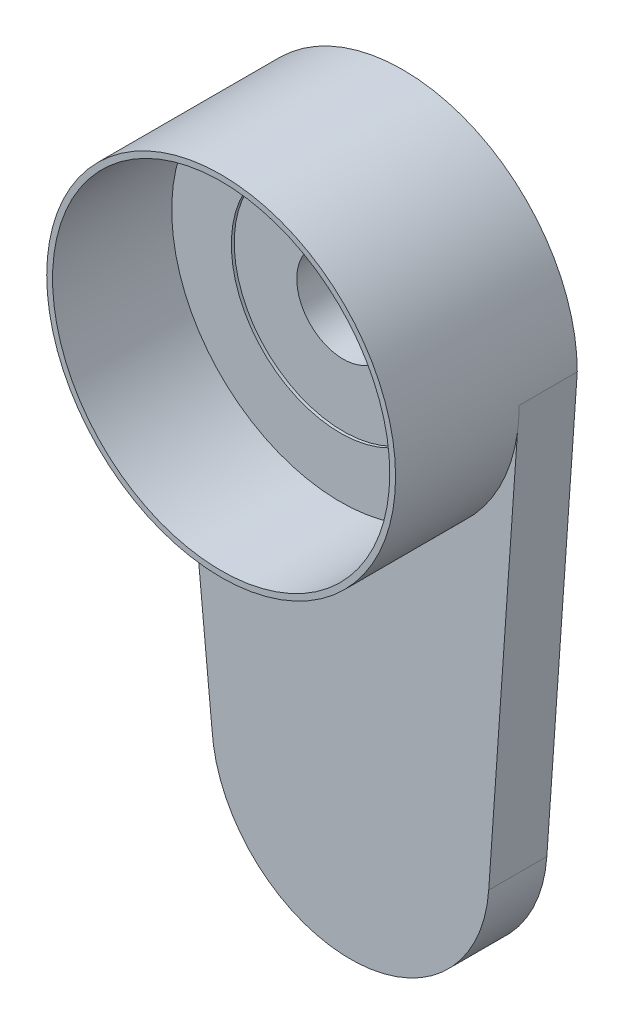
ISO-10303-21;
HEADER;
FILE_DESCRIPTION(('STEP AP214'),'2;1');
FILE_NAME('part.step','',(''),(''),'','','');
FILE_SCHEMA(('AUTOMOTIVE_DESIGN { 1 0 10303 214 1 1 1 1 }'));
ENDSEC;
DATA;
#1=APPLICATION_CONTEXT('core data for automotive mechanical design processes');
#2=APPLICATION_PROTOCOL_DEFINITION('international standard','automotive_design',2000,#1);
#3=PRODUCT_CONTEXT('',#1,'mechanical');
#4=PRODUCT('Part','Part','',(#3));
#5=PRODUCT_RELATED_PRODUCT_CATEGORY('part','',(#4));
#6=PRODUCT_DEFINITION_FORMATION('','',#4);
#7=PRODUCT_DEFINITION_CONTEXT('part definition',#1,'design');
#8=PRODUCT_DEFINITION('design','',#6,#7);
#9=PRODUCT_DEFINITION_SHAPE('','',#8);
#10=(LENGTH_UNIT() NAMED_UNIT(*) SI_UNIT(.MILLI.,.METRE.));
#11=(NAMED_UNIT(*) PLANE_ANGLE_UNIT() SI_UNIT($,.RADIAN.));
#12=(NAMED_UNIT(*) SI_UNIT($,.STERADIAN.) SOLID_ANGLE_UNIT());
#13=UNCERTAINTY_MEASURE_WITH_UNIT(LENGTH_MEASURE(1.E-05),#10,'distance_accuracy_value','');
#14=(GEOMETRIC_REPRESENTATION_CONTEXT(3) GLOBAL_UNCERTAINTY_ASSIGNED_CONTEXT((#13)) GLOBAL_UNIT_ASSIGNED_CONTEXT((#10,
#11,#12)) REPRESENTATION_CONTEXT('',''));
#15=CARTESIAN_POINT('',(0.,0.,0.));
#16=DIRECTION('',(0.,0.,1.));
#17=DIRECTION('',(1.,0.,0.));
#18=AXIS2_PLACEMENT_3D('',#15,#16,#17);
#19=CARTESIAN_POINT('',(0.,0.,0.));
#20=DIRECTION('',(0.,0.,1.));
#21=DIRECTION('',(1.,0.,0.));
#22=AXIS2_PLACEMENT_3D('',#19,#20,#21);
#23=PLANE('',#22);
#24=DIRECTION('',(-0.0697887398607694,-0.997561793468778,0.));
#25=VECTOR('',#24,1.);
#26=CARTESIAN_POINT('',(119.415543814638,-8.35422965993222,0.));
#27=LINE('',#26,#25);
#28=CARTESIAN_POINT('',(120.,0.,0.));
#29=VERTEX_POINT('',#28);
#30=CARTESIAN_POINT('',(118.831087629275,-16.7084593198645,0.));
#31=VERTEX_POINT('',#30);
#32=EDGE_CURVE('E106',#29,#31,#27,.T.);
#33=ORIENTED_EDGE('',*,*,#32,.F.);
#34=CARTESIAN_POINT('',(0.,0.,0.));
#35=DIRECTION('',(0.,0.,1.));
#36=DIRECTION('',(1.,0.,0.));
#37=AXIS2_PLACEMENT_3D('',#34,#35,#36);
#38=CIRCLE('',#37,120.);
#39=EDGE_CURVE('E133',#31,#29,#38,.T.);
#40=ORIENTED_EDGE('',*,*,#39,.F.);
#41=EDGE_LOOP('',(#33,#40));
#42=FACE_BOUND('',#41,.T.);
#43=ADVANCED_FACE('F34',(#42),#23,.F.);
#44=CARTESIAN_POINT('',(0.,0.,85.));
#45=DIRECTION('',(0.,0.,-1.));
#46=DIRECTION('',(-1.,0.,0.));
#47=AXIS2_PLACEMENT_3D('',#44,#45,#46);
#48=CYLINDRICAL_SURFACE('',#47,120.);
#49=CARTESIAN_POINT('',(0.,0.,85.));
#50=DIRECTION('',(0.,0.,1.));
#51=DIRECTION('',(1.,0.,0.));
#52=AXIS2_PLACEMENT_3D('',#49,#50,#51);
#53=CIRCLE('',#52,120.);
#54=CARTESIAN_POINT('',(120.,0.,85.));
#55=VERTEX_POINT('',#54);
#56=EDGE_CURVE('E11',#55,#55,#53,.T.);
#57=ORIENTED_EDGE('',*,*,#56,.F.);
#58=EDGE_LOOP('',(#57));
#59=FACE_BOUND('',#58,.T.);
#60=ORIENTED_EDGE('',*,*,#39,.T.);
#61=DIRECTION('',(0.,0.,1.));
#62=VECTOR('',#61,1.);
#63=CARTESIAN_POINT('',(120.,0.,-40.));
#64=LINE('',#63,#62);
#65=CARTESIAN_POINT('',(120.,0.,-40.));
#66=VERTEX_POINT('',#65);
#67=EDGE_CURVE('E88',#66,#29,#64,.T.);
#68=ORIENTED_EDGE('',*,*,#67,.F.);
#69=CARTESIAN_POINT('',(0.,0.,-40.));
#70=DIRECTION('',(0.,0.,-1.));
#71=DIRECTION('',(-1.,0.,0.));
#72=AXIS2_PLACEMENT_3D('',#69,#70,#71);
#73=CIRCLE('',#72,120.);
#74=CARTESIAN_POINT('',(-120.,1.07552855510562E-13,-40.));
#75=VERTEX_POINT('',#74);
#76=EDGE_CURVE('E91',#75,#66,#73,.T.);
#77=ORIENTED_EDGE('',*,*,#76,.F.);
#78=DIRECTION('',(0.,0.,1.));
#79=VECTOR('',#78,1.);
#80=CARTESIAN_POINT('',(-120.,1.07552855510562E-13,-40.));
#81=LINE('',#80,#79);
#82=CARTESIAN_POINT('',(-120.,1.07552855510562E-13,0.));
#83=VERTEX_POINT('',#82);
#84=EDGE_CURVE('E79',#75,#83,#81,.T.);
#85=ORIENTED_EDGE('',*,*,#84,.T.);
#86=CARTESIAN_POINT('',(-117.805011812381,-22.8468639398211,0.));
#87=VERTEX_POINT('',#86);
#88=EDGE_CURVE('E43',#83,#87,#38,.T.);
#89=ORIENTED_EDGE('',*,*,#88,.T.);
#90=EDGE_CURVE('E136',#87,#31,#38,.T.);
#91=ORIENTED_EDGE('',*,*,#90,.T.);
#92=EDGE_LOOP('',(#60,#68,#77,#85,#89,#91));
#93=FACE_BOUND('',#92,.T.);
#94=ADVANCED_FACE('F36',(#59,#93),#48,.T.);
#95=CARTESIAN_POINT('',(0.,0.,85.));
#96=DIRECTION('',(0.,0.,1.));
#97=DIRECTION('',(1.,0.,0.));
#98=AXIS2_PLACEMENT_3D('',#95,#96,#97);
#99=PLANE('',#98);
#100=CARTESIAN_POINT('',(0.,0.,85.));
#101=DIRECTION('',(0.,0.,1.));
#102=DIRECTION('',(1.,0.,0.));
#103=AXIS2_PLACEMENT_3D('',#100,#101,#102);
#104=CIRCLE('',#103,116.);
#105=CARTESIAN_POINT('',(116.,0.,85.));
#106=VERTEX_POINT('',#105);
#107=EDGE_CURVE('E134',#106,#106,#104,.T.);
#108=ORIENTED_EDGE('',*,*,#107,.F.);
#109=EDGE_LOOP('',(#108));
#110=FACE_BOUND('',#109,.T.);
#111=ORIENTED_EDGE('',*,*,#56,.T.);
#112=EDGE_LOOP('',(#111));
#113=FACE_BOUND('',#112,.T.);
#114=ADVANCED_FACE('F154',(#110,#113),#99,.T.);
#115=ORIENTED_EDGE('',*,*,#88,.F.);
#116=DIRECTION('',(0.0956335930260791,-0.995416604183857,0.));
#117=VECTOR('',#116,1.);
#118=CARTESIAN_POINT('',(-118.902505906191,-11.4234319699105,0.));
#119=LINE('',#118,#117);
#120=EDGE_CURVE('E50',#83,#87,#119,.T.);
#121=ORIENTED_EDGE('',*,*,#120,.T.);
#122=EDGE_LOOP('',(#115,#121));
#123=FACE_BOUND('',#122,.T.);
#124=ADVANCED_FACE('F150',(#123),#23,.F.);
#125=CARTESIAN_POINT('',(0.,0.,3.));
#126=DIRECTION('',(0.,0.,1.));
#127=DIRECTION('',(1.,0.,0.));
#128=AXIS2_PLACEMENT_3D('',#125,#126,#127);
#129=CYLINDRICAL_SURFACE('',#128,116.);
#130=CARTESIAN_POINT('',(0.,0.,3.));
#131=DIRECTION('',(0.,0.,1.));
#132=DIRECTION('',(1.,0.,0.));
#133=AXIS2_PLACEMENT_3D('',#130,#131,#132);
#134=CIRCLE('',#133,116.);
#135=CARTESIAN_POINT('',(116.,0.,3.));
#136=VERTEX_POINT('',#135);
#137=EDGE_CURVE('E130',#136,#136,#134,.T.);
#138=ORIENTED_EDGE('',*,*,#137,.F.);
#139=EDGE_LOOP('',(#138));
#140=FACE_BOUND('',#139,.T.);
#141=ORIENTED_EDGE('',*,*,#107,.T.);
#142=EDGE_LOOP('',(#141));
#143=FACE_BOUND('',#142,.T.);
#144=ADVANCED_FACE('F158',(#140,#143),#129,.F.);
#145=CARTESIAN_POINT('',(0.,0.,3.));
#146=DIRECTION('',(0.,0.,1.));
#147=DIRECTION('',(1.,0.,0.));
#148=AXIS2_PLACEMENT_3D('',#145,#146,#147);
#149=PLANE('',#148);
#150=CARTESIAN_POINT('',(0.,0.,3.));
#151=DIRECTION('',(0.,0.,1.));
#152=DIRECTION('',(1.,0.,0.));
#153=AXIS2_PLACEMENT_3D('',#150,#151,#152);
#154=CIRCLE('',#153,75.);
#155=CARTESIAN_POINT('',(75.,0.,3.));
#156=VERTEX_POINT('',#155);
#157=EDGE_CURVE('E38',#156,#156,#154,.T.);
#158=ORIENTED_EDGE('',*,*,#157,.F.);
#159=EDGE_LOOP('',(#158));
#160=FACE_BOUND('',#159,.T.);
#161=ORIENTED_EDGE('',*,*,#137,.T.);
#162=EDGE_LOOP('',(#161));
#163=FACE_BOUND('',#162,.T.);
#164=ADVANCED_FACE('F163',(#160,#163),#149,.T.);
#165=CARTESIAN_POINT('',(0.,0.,1.));
#166=DIRECTION('',(0.,0.,1.));
#167=DIRECTION('',(1.,0.,0.));
#168=AXIS2_PLACEMENT_3D('',#165,#166,#167);
#169=CYLINDRICAL_SURFACE('',#168,75.);
#170=ORIENTED_EDGE('',*,*,#157,.T.);
#171=EDGE_LOOP('',(#170));
#172=FACE_BOUND('',#171,.T.);
#173=CARTESIAN_POINT('',(0.,0.,1.));
#174=DIRECTION('',(0.,0.,1.));
#175=DIRECTION('',(1.,0.,0.));
#176=AXIS2_PLACEMENT_3D('',#173,#174,#175);
#177=CIRCLE('',#176,75.);
#178=CARTESIAN_POINT('',(75.,0.,1.));
#179=VERTEX_POINT('',#178);
#180=EDGE_CURVE('E127',#179,#179,#177,.T.);
#181=ORIENTED_EDGE('',*,*,#180,.F.);
#182=EDGE_LOOP('',(#181));
#183=FACE_BOUND('',#182,.T.);
#184=ADVANCED_FACE('F174',(#172,#183),#169,.F.);
#185=CARTESIAN_POINT('',(0.,0.,1.));
#186=DIRECTION('',(0.,0.,1.));
#187=DIRECTION('',(1.,0.,0.));
#188=AXIS2_PLACEMENT_3D('',#185,#186,#187);
#189=PLANE('',#188);
#190=CARTESIAN_POINT('',(0.,0.,1.));
#191=DIRECTION('',(0.,0.,1.));
#192=DIRECTION('',(1.,0.,0.));
#193=AXIS2_PLACEMENT_3D('',#190,#191,#192);
#194=CIRCLE('',#193,32.);
#195=CARTESIAN_POINT('',(32.,0.,1.));
#196=VERTEX_POINT('',#195);
#197=EDGE_CURVE('E87',#196,#196,#194,.T.);
#198=ORIENTED_EDGE('',*,*,#197,.F.);
#199=EDGE_LOOP('',(#198));
#200=FACE_BOUND('',#199,.T.);
#201=ORIENTED_EDGE('',*,*,#180,.T.);
#202=EDGE_LOOP('',(#201));
#203=FACE_BOUND('',#202,.T.);
#204=ADVANCED_FACE('F178',(#200,#203),#189,.T.);
#205=CARTESIAN_POINT('',(0.,0.,-4.));
#206=DIRECTION('',(0.,0.,1.));
#207=DIRECTION('',(1.,0.,0.));
#208=AXIS2_PLACEMENT_3D('',#205,#206,#207);
#209=CYLINDRICAL_SURFACE('',#208,32.);
#210=ORIENTED_EDGE('',*,*,#197,.T.);
#211=EDGE_LOOP('',(#210));
#212=FACE_BOUND('',#211,.T.);
#213=CARTESIAN_POINT('',(0.,0.,-40.));
#214=DIRECTION('',(0.,0.,-1.));
#215=DIRECTION('',(-1.,0.,0.));
#216=AXIS2_PLACEMENT_3D('',#213,#214,#215);
#217=CIRCLE('',#216,32.);
#218=CARTESIAN_POINT('',(-32.,0.,-40.));
#219=VERTEX_POINT('',#218);
#220=EDGE_CURVE('E111',#219,#219,#217,.F.);
#221=ORIENTED_EDGE('',*,*,#220,.F.);
#222=EDGE_LOOP('',(#221));
#223=FACE_BOUND('',#222,.T.);
#224=ADVANCED_FACE('F182',(#212,#223),#209,.F.);
#225=CARTESIAN_POINT('',(-118.902505906191,-11.4234319699105,-40.));
#226=DIRECTION('',(-0.995416604183857,-0.0956335930260791,0.));
#227=DIRECTION('',(0.0956335930260791,-0.995416604183857,0.));
#228=AXIS2_PLACEMENT_3D('',#225,#226,#227);
#229=PLANE('',#228);
#230=ORIENTED_EDGE('',*,*,#120,.F.);
#231=ORIENTED_EDGE('',*,*,#84,.F.);
#232=DIRECTION('',(0.0956335930260791,-0.995416604183857,0.));
#233=VECTOR('',#232,1.);
#234=CARTESIAN_POINT('',(-118.902505906191,-11.4234319699105,-40.));
#235=LINE('',#234,#233);
#236=CARTESIAN_POINT('',(-91.3099220921763,-298.624981255157,-40.));
#237=VERTEX_POINT('',#236);
#238=EDGE_CURVE('E84',#75,#237,#235,.T.);
#239=ORIENTED_EDGE('',*,*,#238,.T.);
#240=DIRECTION('',(0.,0.,1.));
#241=VECTOR('',#240,1.);
#242=CARTESIAN_POINT('',(-91.3099220921763,-298.624981255157,-40.));
#243=LINE('',#242,#241);
#244=CARTESIAN_POINT('',(-91.3099220921763,-298.624981255157,0.));
#245=VERTEX_POINT('',#244);
#246=EDGE_CURVE('E114',#237,#245,#243,.T.);
#247=ORIENTED_EDGE('',*,*,#246,.T.);
#248=EDGE_CURVE('E117',#87,#245,#119,.T.);
#249=ORIENTED_EDGE('',*,*,#248,.F.);
#250=EDGE_LOOP('',(#230,#231,#239,#247,#249));
#251=FACE_BOUND('',#250,.T.);
#252=ADVANCED_FACE('F81',(#251),#229,.T.);
#253=CARTESIAN_POINT('',(119.415543814638,-8.35422965993222,-40.));
#254=DIRECTION('',(-0.997561793468778,0.0697887398607694,0.));
#255=DIRECTION('',(-0.0697887398607694,-0.997561793468778,0.));
#256=AXIS2_PLACEMENT_3D('',#253,#254,#255);
#257=PLANE('',#256);
#258=ORIENTED_EDGE('',*,*,#32,.T.);
#259=CARTESIAN_POINT('',(99.0633780417692,-299.268538040634,0.));
#260=VERTEX_POINT('',#259);
#261=EDGE_CURVE('E116',#31,#260,#27,.T.);
#262=ORIENTED_EDGE('',*,*,#261,.T.);
#263=DIRECTION('',(0.,0.,1.));
#264=VECTOR('',#263,1.);
#265=CARTESIAN_POINT('',(99.0633780417692,-299.268538040634,-40.));
#266=LINE('',#265,#264);
#267=CARTESIAN_POINT('',(99.0633780417692,-299.268538040634,-40.));
#268=VERTEX_POINT('',#267);
#269=EDGE_CURVE('E121',#268,#260,#266,.T.);
#270=ORIENTED_EDGE('',*,*,#269,.F.);
#271=DIRECTION('',(-0.0697887398607694,-0.997561793468778,0.));
#272=VECTOR('',#271,1.);
#273=CARTESIAN_POINT('',(119.415543814638,-8.35422965993222,-40.));
#274=LINE('',#273,#272);
#275=EDGE_CURVE('E96',#66,#268,#274,.T.);
#276=ORIENTED_EDGE('',*,*,#275,.F.);
#277=ORIENTED_EDGE('',*,*,#67,.T.);
#278=EDGE_LOOP('',(#258,#262,#270,#276,#277));
#279=FACE_BOUND('',#278,.T.);
#280=ADVANCED_FACE('F147',(#279),#257,.F.);
#281=CARTESIAN_POINT('',(3.8981465337455,-292.610843621114,-40.));
#282=DIRECTION('',(0.,0.,1.));
#283=DIRECTION('',(1.,0.,0.));
#284=AXIS2_PLACEMENT_3D('',#281,#282,#283);
#285=CYLINDRICAL_SURFACE('',#284,95.397831122932);
#286=CARTESIAN_POINT('',(3.8981465337455,-292.610843621114,0.));
#287=DIRECTION('',(0.,0.,-1.));
#288=DIRECTION('',(-1.,0.,0.));
#289=AXIS2_PLACEMENT_3D('',#286,#287,#288);
#290=CIRCLE('',#289,95.397831122932);
#291=EDGE_CURVE('E103',#260,#245,#290,.T.);
#292=ORIENTED_EDGE('',*,*,#291,.T.);
#293=ORIENTED_EDGE('',*,*,#246,.F.);
#294=CARTESIAN_POINT('',(3.8981465337455,-292.610843621114,-40.));
#295=DIRECTION('',(0.,0.,-1.));
#296=DIRECTION('',(-1.,0.,0.));
#297=AXIS2_PLACEMENT_3D('',#294,#295,#296);
#298=CIRCLE('',#297,95.397831122932);
#299=EDGE_CURVE('E101',#268,#237,#298,.T.);
#300=ORIENTED_EDGE('',*,*,#299,.F.);
#301=ORIENTED_EDGE('',*,*,#269,.T.);
#302=EDGE_LOOP('',(#292,#293,#300,#301));
#303=FACE_BOUND('',#302,.T.);
#304=ADVANCED_FACE('F144',(#303),#285,.T.);
#305=CARTESIAN_POINT('',(0.,0.,-40.));
#306=DIRECTION('',(0.,0.,-1.));
#307=DIRECTION('',(-1.,0.,0.));
#308=AXIS2_PLACEMENT_3D('',#305,#306,#307);
#309=PLANE('',#308);
#310=ORIENTED_EDGE('',*,*,#238,.F.);
#311=ORIENTED_EDGE('',*,*,#76,.T.);
#312=ORIENTED_EDGE('',*,*,#275,.T.);
#313=ORIENTED_EDGE('',*,*,#299,.T.);
#314=EDGE_LOOP('',(#310,#311,#312,#313));
#315=FACE_BOUND('',#314,.T.);
#316=ORIENTED_EDGE('',*,*,#220,.T.);
#317=EDGE_LOOP('',(#316));
#318=FACE_BOUND('',#317,.T.);
#319=ADVANCED_FACE('F98',(#315,#318),#309,.T.);
#320=CARTESIAN_POINT('',(0.,0.,0.));
#321=DIRECTION('',(0.,0.,-1.));
#322=DIRECTION('',(-1.,0.,0.));
#323=AXIS2_PLACEMENT_3D('',#320,#321,#322);
#324=PLANE('',#323);
#325=ORIENTED_EDGE('',*,*,#90,.F.);
#326=ORIENTED_EDGE('',*,*,#248,.T.);
#327=ORIENTED_EDGE('',*,*,#291,.F.);
#328=ORIENTED_EDGE('',*,*,#261,.F.);
#329=EDGE_LOOP('',(#325,#326,#327,#328));
#330=FACE_BOUND('',#329,.T.);
#331=ADVANCED_FACE('F141',(#330),#324,.F.);
#332=CLOSED_SHELL('',(#43,#94,#114,#124,#144,#164,#184,#204,#224,#252,#280,#304,#319,#331));
#333=MANIFOLD_SOLID_BREP('B2',#332);
#334=ADVANCED_BREP_SHAPE_REPRESENTATION('',(#18,#333),#14);
#335=SHAPE_DEFINITION_REPRESENTATION(#9,#334);
ENDSEC;
END-ISO-10303-21;
